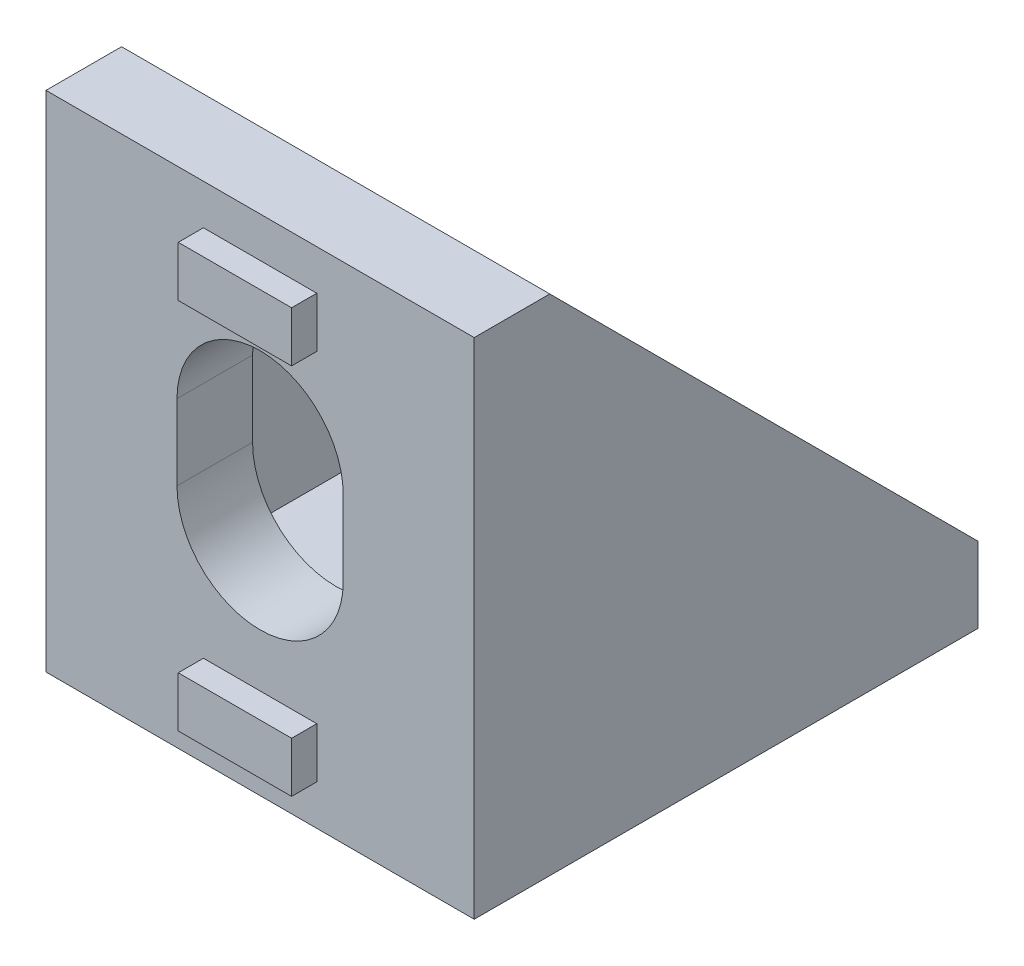
ISO-10303-21;
HEADER;
FILE_DESCRIPTION(('STEP AP214'),'2;1');
FILE_NAME('part.step','',(''),(''),'','','');
FILE_SCHEMA(('AUTOMOTIVE_DESIGN { 1 0 10303 214 1 1 1 1 }'));
ENDSEC;
DATA;
#1=APPLICATION_CONTEXT('core data for automotive mechanical design processes');
#2=APPLICATION_PROTOCOL_DEFINITION('international standard','automotive_design',2000,#1);
#3=PRODUCT_CONTEXT('',#1,'mechanical');
#4=PRODUCT('Part','Part','',(#3));
#5=PRODUCT_RELATED_PRODUCT_CATEGORY('part','',(#4));
#6=PRODUCT_DEFINITION_FORMATION('','',#4);
#7=PRODUCT_DEFINITION_CONTEXT('part definition',#1,'design');
#8=PRODUCT_DEFINITION('design','',#6,#7);
#9=PRODUCT_DEFINITION_SHAPE('','',#8);
#10=(LENGTH_UNIT() NAMED_UNIT(*) SI_UNIT(.MILLI.,.METRE.));
#11=(NAMED_UNIT(*) PLANE_ANGLE_UNIT() SI_UNIT($,.RADIAN.));
#12=(NAMED_UNIT(*) SI_UNIT($,.STERADIAN.) SOLID_ANGLE_UNIT());
#13=UNCERTAINTY_MEASURE_WITH_UNIT(LENGTH_MEASURE(1.E-05),#10,'distance_accuracy_value','');
#14=(GEOMETRIC_REPRESENTATION_CONTEXT(3) GLOBAL_UNCERTAINTY_ASSIGNED_CONTEXT((#13)) GLOBAL_UNIT_ASSIGNED_CONTEXT((#10,
#11,#12)) REPRESENTATION_CONTEXT('',''));
#15=CARTESIAN_POINT('',(0.,0.,0.));
#16=DIRECTION('',(0.,0.,1.));
#17=DIRECTION('',(1.,0.,0.));
#18=AXIS2_PLACEMENT_3D('',#15,#16,#17);
#19=CARTESIAN_POINT('',(3.3,9.,-4.));
#20=DIRECTION('',(1.,0.,0.));
#21=DIRECTION('',(0.,1.,0.));
#22=AXIS2_PLACEMENT_3D('',#19,#20,#21);
#23=PLANE('',#22);
#24=DIRECTION('',(0.,0.,1.));
#25=VECTOR('',#24,1.);
#26=CARTESIAN_POINT('',(3.3,12.,-4.));
#27=LINE('',#26,#25);
#28=CARTESIAN_POINT('',(3.3,12.,-3.));
#29=VERTEX_POINT('',#28);
#30=CARTESIAN_POINT('',(3.3,12.,0.));
#31=VERTEX_POINT('',#30);
#32=EDGE_CURVE('E150',#29,#31,#27,.T.);
#33=ORIENTED_EDGE('',*,*,#32,.F.);
#34=DIRECTION('',(0.,-1.,0.));
#35=VECTOR('',#34,1.);
#36=CARTESIAN_POINT('',(3.3,3.,-3.));
#37=LINE('',#36,#35);
#38=CARTESIAN_POINT('',(3.3,9.,-3.));
#39=VERTEX_POINT('',#38);
#40=EDGE_CURVE('E179',#29,#39,#37,.T.);
#41=ORIENTED_EDGE('',*,*,#40,.T.);
#42=DIRECTION('',(0.,0.,1.));
#43=VECTOR('',#42,1.);
#44=CARTESIAN_POINT('',(3.3,9.,-4.));
#45=LINE('',#44,#43);
#46=CARTESIAN_POINT('',(3.3,9.,0.));
#47=VERTEX_POINT('',#46);
#48=EDGE_CURVE('E11',#39,#47,#45,.T.);
#49=ORIENTED_EDGE('',*,*,#48,.T.);
#50=DIRECTION('',(0.,1.,0.));
#51=VECTOR('',#50,1.);
#52=CARTESIAN_POINT('',(3.3,9.,0.));
#53=LINE('',#52,#51);
#54=EDGE_CURVE('E149',#47,#31,#53,.T.);
#55=ORIENTED_EDGE('',*,*,#54,.T.);
#56=EDGE_LOOP('',(#33,#41,#49,#55));
#57=FACE_BOUND('',#56,.T.);
#58=ADVANCED_FACE('F17',(#57),#23,.F.);
#59=CARTESIAN_POINT('',(0.,9.,-4.));
#60=DIRECTION('',(0.,0.,-1.));
#61=DIRECTION('',(-1.,0.,0.));
#62=AXIS2_PLACEMENT_3D('',#59,#60,#61);
#63=CYLINDRICAL_SURFACE('',#62,3.3);
#64=ORIENTED_EDGE('',*,*,#48,.F.);
#65=CARTESIAN_POINT('',(0.,9.,-3.));
#66=DIRECTION('',(0.,0.,-1.));
#67=DIRECTION('',(1.,0.,0.));
#68=AXIS2_PLACEMENT_3D('',#65,#66,#67);
#69=CIRCLE('',#68,3.3);
#70=CARTESIAN_POINT('',(-3.3,9.,-3.));
#71=VERTEX_POINT('',#70);
#72=EDGE_CURVE('E175',#39,#71,#69,.T.);
#73=ORIENTED_EDGE('',*,*,#72,.T.);
#74=DIRECTION('',(0.,0.,1.));
#75=VECTOR('',#74,1.);
#76=CARTESIAN_POINT('',(-3.3,9.,-4.));
#77=LINE('',#76,#75);
#78=CARTESIAN_POINT('',(-3.3,9.,0.));
#79=VERTEX_POINT('',#78);
#80=EDGE_CURVE('E27',#71,#79,#77,.T.);
#81=ORIENTED_EDGE('',*,*,#80,.T.);
#82=CARTESIAN_POINT('',(0.,9.,0.));
#83=DIRECTION('',(0.,0.,1.));
#84=DIRECTION('',(1.,0.,0.));
#85=AXIS2_PLACEMENT_3D('',#82,#83,#84);
#86=CIRCLE('',#85,3.3);
#87=EDGE_CURVE('E144',#79,#47,#86,.T.);
#88=ORIENTED_EDGE('',*,*,#87,.T.);
#89=EDGE_LOOP('',(#64,#73,#81,#88));
#90=FACE_BOUND('',#89,.T.);
#91=ADVANCED_FACE('F404',(#90),#63,.F.);
#92=CARTESIAN_POINT('',(-3.3,12.,-4.));
#93=DIRECTION('',(-1.,0.,0.));
#94=DIRECTION('',(0.,0.,1.));
#95=AXIS2_PLACEMENT_3D('',#92,#93,#94);
#96=PLANE('',#95);
#97=ORIENTED_EDGE('',*,*,#80,.F.);
#98=DIRECTION('',(0.,1.,0.));
#99=VECTOR('',#98,1.);
#100=CARTESIAN_POINT('',(-3.3,3.,-3.));
#101=LINE('',#100,#99);
#102=CARTESIAN_POINT('',(-3.3,12.,-3.));
#103=VERTEX_POINT('',#102);
#104=EDGE_CURVE('E171',#71,#103,#101,.T.);
#105=ORIENTED_EDGE('',*,*,#104,.T.);
#106=DIRECTION('',(0.,0.,1.));
#107=VECTOR('',#106,1.);
#108=CARTESIAN_POINT('',(-3.3,12.,-4.));
#109=LINE('',#108,#107);
#110=CARTESIAN_POINT('',(-3.3,12.,0.));
#111=VERTEX_POINT('',#110);
#112=EDGE_CURVE('E154',#103,#111,#109,.T.);
#113=ORIENTED_EDGE('',*,*,#112,.T.);
#114=DIRECTION('',(0.,-1.,0.));
#115=VECTOR('',#114,1.);
#116=CARTESIAN_POINT('',(-3.3,12.,0.));
#117=LINE('',#116,#115);
#118=EDGE_CURVE('E148',#111,#79,#117,.T.);
#119=ORIENTED_EDGE('',*,*,#118,.T.);
#120=EDGE_LOOP('',(#97,#105,#113,#119));
#121=FACE_BOUND('',#120,.T.);
#122=ADVANCED_FACE('F19',(#121),#96,.F.);
#123=CARTESIAN_POINT('',(0.,12.,-4.));
#124=DIRECTION('',(0.,0.,-1.));
#125=DIRECTION('',(-1.,0.,0.));
#126=AXIS2_PLACEMENT_3D('',#123,#124,#125);
#127=CYLINDRICAL_SURFACE('',#126,3.3);
#128=ORIENTED_EDGE('',*,*,#112,.F.);
#129=CARTESIAN_POINT('',(0.,12.,-3.));
#130=DIRECTION('',(0.,0.,-1.));
#131=DIRECTION('',(1.,0.,0.));
#132=AXIS2_PLACEMENT_3D('',#129,#130,#131);
#133=CIRCLE('',#132,3.3);
#134=EDGE_CURVE('E185',#103,#29,#133,.T.);
#135=ORIENTED_EDGE('',*,*,#134,.T.);
#136=ORIENTED_EDGE('',*,*,#32,.T.);
#137=CARTESIAN_POINT('',(0.,12.,0.));
#138=DIRECTION('',(0.,0.,1.));
#139=DIRECTION('',(1.,0.,0.));
#140=AXIS2_PLACEMENT_3D('',#137,#138,#139);
#141=CIRCLE('',#140,3.3);
#142=EDGE_CURVE('E427',#31,#111,#141,.T.);
#143=ORIENTED_EDGE('',*,*,#142,.T.);
#144=EDGE_LOOP('',(#128,#135,#136,#143));
#145=FACE_BOUND('',#144,.T.);
#146=ADVANCED_FACE('F1005',(#145),#127,.F.);
#147=CARTESIAN_POINT('',(3.3,4.,-12.));
#148=DIRECTION('',(1.,0.,0.));
#149=DIRECTION('',(0.,1.,0.));
#150=AXIS2_PLACEMENT_3D('',#147,#148,#149);
#151=PLANE('',#150);
#152=DIRECTION('',(0.,-1.,0.));
#153=VECTOR('',#152,1.);
#154=CARTESIAN_POINT('',(3.3,4.,-9.));
#155=LINE('',#154,#153);
#156=CARTESIAN_POINT('',(3.3,3.,-9.));
#157=VERTEX_POINT('',#156);
#158=CARTESIAN_POINT('',(3.3,0.,-9.));
#159=VERTEX_POINT('',#158);
#160=EDGE_CURVE('E265',#157,#159,#155,.T.);
#161=ORIENTED_EDGE('',*,*,#160,.F.);
#162=DIRECTION('',(0.,0.,-1.));
#163=VECTOR('',#162,1.);
#164=CARTESIAN_POINT('',(3.3,3.,-31.));
#165=LINE('',#164,#163);
#166=CARTESIAN_POINT('',(3.3,3.,-12.));
#167=VERTEX_POINT('',#166);
#168=EDGE_CURVE('E294',#157,#167,#165,.T.);
#169=ORIENTED_EDGE('',*,*,#168,.T.);
#170=DIRECTION('',(0.,-1.,0.));
#171=VECTOR('',#170,1.);
#172=CARTESIAN_POINT('',(3.3,4.,-12.));
#173=LINE('',#172,#171);
#174=CARTESIAN_POINT('',(3.3,0.,-12.));
#175=VERTEX_POINT('',#174);
#176=EDGE_CURVE('E390',#167,#175,#173,.T.);
#177=ORIENTED_EDGE('',*,*,#176,.T.);
#178=DIRECTION('',(0.,0.,1.));
#179=VECTOR('',#178,1.);
#180=CARTESIAN_POINT('',(3.3,0.,-12.));
#181=LINE('',#180,#179);
#182=EDGE_CURVE('E250',#175,#159,#181,.T.);
#183=ORIENTED_EDGE('',*,*,#182,.T.);
#184=EDGE_LOOP('',(#161,#169,#177,#183));
#185=FACE_BOUND('',#184,.T.);
#186=ADVANCED_FACE('F995',(#185),#151,.F.);
#187=CARTESIAN_POINT('',(0.,4.,-12.));
#188=DIRECTION('',(0.,1.,0.));
#189=DIRECTION('',(0.,0.,-1.));
#190=AXIS2_PLACEMENT_3D('',#187,#188,#189);
#191=CYLINDRICAL_SURFACE('',#190,3.3);
#192=ORIENTED_EDGE('',*,*,#176,.F.);
#193=CARTESIAN_POINT('',(0.,3.,-12.));
#194=DIRECTION('',(0.,1.,0.));
#195=DIRECTION('',(0.,0.,-1.));
#196=AXIS2_PLACEMENT_3D('',#193,#194,#195);
#197=CIRCLE('',#196,3.3);
#198=CARTESIAN_POINT('',(-3.3,3.,-12.));
#199=VERTEX_POINT('',#198);
#200=EDGE_CURVE('E286',#167,#199,#197,.T.);
#201=ORIENTED_EDGE('',*,*,#200,.T.);
#202=DIRECTION('',(0.,-1.,0.));
#203=VECTOR('',#202,1.);
#204=CARTESIAN_POINT('',(-3.3,4.,-12.));
#205=LINE('',#204,#203);
#206=CARTESIAN_POINT('',(-3.3,0.,-12.));
#207=VERTEX_POINT('',#206);
#208=EDGE_CURVE('E269',#199,#207,#205,.T.);
#209=ORIENTED_EDGE('',*,*,#208,.T.);
#210=CARTESIAN_POINT('',(0.,0.,-12.));
#211=DIRECTION('',(0.,-1.,0.));
#212=DIRECTION('',(1.,0.,0.));
#213=AXIS2_PLACEMENT_3D('',#210,#211,#212);
#214=CIRCLE('',#213,3.3);
#215=EDGE_CURVE('E254',#207,#175,#214,.T.);
#216=ORIENTED_EDGE('',*,*,#215,.T.);
#217=EDGE_LOOP('',(#192,#201,#209,#216));
#218=FACE_BOUND('',#217,.T.);
#219=ADVANCED_FACE('F534',(#218),#191,.F.);
#220=CARTESIAN_POINT('',(-3.3,4.,-9.));
#221=DIRECTION('',(-1.,0.,0.));
#222=DIRECTION('',(0.,0.,1.));
#223=AXIS2_PLACEMENT_3D('',#220,#221,#222);
#224=PLANE('',#223);
#225=ORIENTED_EDGE('',*,*,#208,.F.);
#226=DIRECTION('',(0.,0.,1.));
#227=VECTOR('',#226,1.);
#228=CARTESIAN_POINT('',(-3.3,3.,-31.));
#229=LINE('',#228,#227);
#230=CARTESIAN_POINT('',(-3.3,3.,-9.));
#231=VERTEX_POINT('',#230);
#232=EDGE_CURVE('E142',#199,#231,#229,.T.);
#233=ORIENTED_EDGE('',*,*,#232,.T.);
#234=DIRECTION('',(0.,-1.,0.));
#235=VECTOR('',#234,1.);
#236=CARTESIAN_POINT('',(-3.3,4.,-9.));
#237=LINE('',#236,#235);
#238=CARTESIAN_POINT('',(-3.3,0.,-9.));
#239=VERTEX_POINT('',#238);
#240=EDGE_CURVE('E270',#231,#239,#237,.T.);
#241=ORIENTED_EDGE('',*,*,#240,.T.);
#242=DIRECTION('',(0.,0.,-1.));
#243=VECTOR('',#242,1.);
#244=CARTESIAN_POINT('',(-3.3,0.,-9.));
#245=LINE('',#244,#243);
#246=EDGE_CURVE('E264',#239,#207,#245,.T.);
#247=ORIENTED_EDGE('',*,*,#246,.T.);
#248=EDGE_LOOP('',(#225,#233,#241,#247));
#249=FACE_BOUND('',#248,.T.);
#250=ADVANCED_FACE('F519',(#249),#224,.F.);
#251=CARTESIAN_POINT('',(0.,4.,-9.));
#252=DIRECTION('',(0.,1.,0.));
#253=DIRECTION('',(0.,0.,1.));
#254=AXIS2_PLACEMENT_3D('',#251,#252,#253);
#255=CYLINDRICAL_SURFACE('',#254,3.3);
#256=ORIENTED_EDGE('',*,*,#240,.F.);
#257=CARTESIAN_POINT('',(0.,3.,-9.));
#258=DIRECTION('',(0.,1.,0.));
#259=DIRECTION('',(0.,0.,-1.));
#260=AXIS2_PLACEMENT_3D('',#257,#258,#259);
#261=CIRCLE('',#260,3.3);
#262=EDGE_CURVE('E299',#231,#157,#261,.T.);
#263=ORIENTED_EDGE('',*,*,#262,.T.);
#264=ORIENTED_EDGE('',*,*,#160,.T.);
#265=CARTESIAN_POINT('',(0.,0.,-9.));
#266=DIRECTION('',(0.,-1.,0.));
#267=DIRECTION('',(1.,0.,0.));
#268=AXIS2_PLACEMENT_3D('',#265,#266,#267);
#269=CIRCLE('',#268,3.3);
#270=EDGE_CURVE('E246',#159,#239,#269,.T.);
#271=ORIENTED_EDGE('',*,*,#270,.T.);
#272=EDGE_LOOP('',(#256,#263,#264,#271));
#273=FACE_BOUND('',#272,.T.);
#274=ADVANCED_FACE('F796',(#273),#255,.F.);
#275=CARTESIAN_POINT('',(2.25,-1.,-16.4));
#276=DIRECTION('',(0.,0.,1.));
#277=DIRECTION('',(1.,0.,0.));
#278=AXIS2_PLACEMENT_3D('',#275,#276,#277);
#279=PLANE('',#278);
#280=DIRECTION('',(0.,1.,0.));
#281=VECTOR('',#280,1.);
#282=CARTESIAN_POINT('',(-2.25,-1.,-16.4));
#283=LINE('',#282,#281);
#284=CARTESIAN_POINT('',(-2.25,-1.,-16.4));
#285=VERTEX_POINT('',#284);
#286=CARTESIAN_POINT('',(-2.25,0.,-16.4));
#287=VERTEX_POINT('',#286);
#288=EDGE_CURVE('E106',#285,#287,#283,.T.);
#289=ORIENTED_EDGE('',*,*,#288,.F.);
#290=DIRECTION('',(-1.,0.,0.));
#291=VECTOR('',#290,1.);
#292=CARTESIAN_POINT('',(2.25,-1.,-16.4));
#293=LINE('',#292,#291);
#294=CARTESIAN_POINT('',(2.25,-1.,-16.4));
#295=VERTEX_POINT('',#294);
#296=EDGE_CURVE('E39',#295,#285,#293,.T.);
#297=ORIENTED_EDGE('',*,*,#296,.F.);
#298=DIRECTION('',(0.,1.,0.));
#299=VECTOR('',#298,1.);
#300=CARTESIAN_POINT('',(2.25,-1.,-16.4));
#301=LINE('',#300,#299);
#302=CARTESIAN_POINT('',(2.25,0.,-16.4));
#303=VERTEX_POINT('',#302);
#304=EDGE_CURVE('E120',#295,#303,#301,.T.);
#305=ORIENTED_EDGE('',*,*,#304,.T.);
#306=DIRECTION('',(-1.,0.,0.));
#307=VECTOR('',#306,1.);
#308=CARTESIAN_POINT('',(2.25,0.,-16.4));
#309=LINE('',#308,#307);
#310=EDGE_CURVE('E180',#303,#287,#309,.T.);
#311=ORIENTED_EDGE('',*,*,#310,.T.);
#312=EDGE_LOOP('',(#289,#297,#305,#311));
#313=FACE_BOUND('',#312,.T.);
#314=ADVANCED_FACE('F744',(#313),#279,.T.);
#315=CARTESIAN_POINT('',(2.25,-1.,-18.4));
#316=DIRECTION('',(0.,-1.,0.));
#317=DIRECTION('',(0.,0.,-1.));
#318=AXIS2_PLACEMENT_3D('',#315,#316,#317);
#319=PLANE('',#318);
#320=DIRECTION('',(0.,0.,1.));
#321=VECTOR('',#320,1.);
#322=CARTESIAN_POINT('',(-2.25,-1.,-18.4));
#323=LINE('',#322,#321);
#324=CARTESIAN_POINT('',(-2.25,-1.,-18.4));
#325=VERTEX_POINT('',#324);
#326=EDGE_CURVE('E97',#325,#285,#323,.T.);
#327=ORIENTED_EDGE('',*,*,#326,.F.);
#328=DIRECTION('',(-1.,0.,0.));
#329=VECTOR('',#328,1.);
#330=CARTESIAN_POINT('',(2.25,-1.,-18.4));
#331=LINE('',#330,#329);
#332=CARTESIAN_POINT('',(2.25,-1.,-18.4));
#333=VERTEX_POINT('',#332);
#334=EDGE_CURVE('E101',#333,#325,#331,.T.);
#335=ORIENTED_EDGE('',*,*,#334,.F.);
#336=DIRECTION('',(0.,0.,1.));
#337=VECTOR('',#336,1.);
#338=CARTESIAN_POINT('',(2.25,-1.,-18.4));
#339=LINE('',#338,#337);
#340=EDGE_CURVE('E107',#333,#295,#339,.T.);
#341=ORIENTED_EDGE('',*,*,#340,.T.);
#342=ORIENTED_EDGE('',*,*,#296,.T.);
#343=EDGE_LOOP('',(#327,#335,#341,#342));
#344=FACE_BOUND('',#343,.T.);
#345=ADVANCED_FACE('F99',(#344),#319,.T.);
#346=CARTESIAN_POINT('',(-2.25,0.,0.));
#347=DIRECTION('',(-1.,0.,0.));
#348=DIRECTION('',(0.,0.,1.));
#349=AXIS2_PLACEMENT_3D('',#346,#347,#348);
#350=PLANE('',#349);
#351=DIRECTION('',(0.,-1.,0.));
#352=VECTOR('',#351,1.);
#353=CARTESIAN_POINT('',(-2.25,0.5,-18.4));
#354=LINE('',#353,#352);
#355=CARTESIAN_POINT('',(-2.25,0.,-18.4));
#356=VERTEX_POINT('',#355);
#357=EDGE_CURVE('E111',#356,#325,#354,.T.);
#358=ORIENTED_EDGE('',*,*,#357,.T.);
#359=ORIENTED_EDGE('',*,*,#326,.T.);
#360=ORIENTED_EDGE('',*,*,#288,.T.);
#361=DIRECTION('',(0.,0.,1.));
#362=VECTOR('',#361,1.);
#363=CARTESIAN_POINT('',(-2.25,0.,-20.));
#364=LINE('',#363,#362);
#365=EDGE_CURVE('E115',#356,#287,#364,.T.);
#366=ORIENTED_EDGE('',*,*,#365,.F.);
#367=EDGE_LOOP('',(#358,#359,#360,#366));
#368=FACE_BOUND('',#367,.T.);
#369=ADVANCED_FACE('F112',(#368),#350,.T.);
#370=CARTESIAN_POINT('',(2.25,0.,0.));
#371=DIRECTION('',(-1.,0.,0.));
#372=DIRECTION('',(0.,0.,1.));
#373=AXIS2_PLACEMENT_3D('',#370,#371,#372);
#374=PLANE('',#373);
#375=DIRECTION('',(0.,0.,1.));
#376=VECTOR('',#375,1.);
#377=CARTESIAN_POINT('',(2.25,0.,-20.));
#378=LINE('',#377,#376);
#379=CARTESIAN_POINT('',(2.25,0.,-18.4));
#380=VERTEX_POINT('',#379);
#381=EDGE_CURVE('E184',#380,#303,#378,.T.);
#382=ORIENTED_EDGE('',*,*,#381,.T.);
#383=ORIENTED_EDGE('',*,*,#304,.F.);
#384=ORIENTED_EDGE('',*,*,#340,.F.);
#385=DIRECTION('',(0.,-1.,0.));
#386=VECTOR('',#385,1.);
#387=CARTESIAN_POINT('',(2.25,0.5,-18.4));
#388=LINE('',#387,#386);
#389=EDGE_CURVE('E124',#380,#333,#388,.T.);
#390=ORIENTED_EDGE('',*,*,#389,.F.);
#391=EDGE_LOOP('',(#382,#383,#384,#390));
#392=FACE_BOUND('',#391,.T.);
#393=ADVANCED_FACE('F749',(#392),#374,.F.);
#394=CARTESIAN_POINT('',(2.25,0.5,-18.4));
#395=DIRECTION('',(0.,0.,-1.));
#396=DIRECTION('',(0.,-1.,0.));
#397=AXIS2_PLACEMENT_3D('',#394,#395,#396);
#398=PLANE('',#397);
#399=ORIENTED_EDGE('',*,*,#389,.T.);
#400=ORIENTED_EDGE('',*,*,#334,.T.);
#401=ORIENTED_EDGE('',*,*,#357,.F.);
#402=DIRECTION('',(-1.,0.,0.));
#403=VECTOR('',#402,1.);
#404=CARTESIAN_POINT('',(8.5,0.,-18.4));
#405=LINE('',#404,#403);
#406=EDGE_CURVE('E207',#380,#356,#405,.T.);
#407=ORIENTED_EDGE('',*,*,#406,.F.);
#408=EDGE_LOOP('',(#399,#400,#401,#407));
#409=FACE_BOUND('',#408,.T.);
#410=ADVANCED_FACE('F122',(#409),#398,.T.);
#411=CARTESIAN_POINT('',(2.25,0.,-3.6));
#412=DIRECTION('',(0.,0.,-1.));
#413=DIRECTION('',(-1.,0.,0.));
#414=AXIS2_PLACEMENT_3D('',#411,#412,#413);
#415=PLANE('',#414);
#416=DIRECTION('',(0.,-1.,0.));
#417=VECTOR('',#416,1.);
#418=CARTESIAN_POINT('',(-2.25,0.,-3.6));
#419=LINE('',#418,#417);
#420=CARTESIAN_POINT('',(-2.25,0.,-3.6));
#421=VERTEX_POINT('',#420);
#422=CARTESIAN_POINT('',(-2.25,-1.,-3.6));
#423=VERTEX_POINT('',#422);
#424=EDGE_CURVE('E245',#421,#423,#419,.T.);
#425=ORIENTED_EDGE('',*,*,#424,.F.);
#426=DIRECTION('',(-1.,0.,0.));
#427=VECTOR('',#426,1.);
#428=CARTESIAN_POINT('',(2.25,0.,-3.6));
#429=LINE('',#428,#427);
#430=CARTESIAN_POINT('',(2.25,0.,-3.6));
#431=VERTEX_POINT('',#430);
#432=EDGE_CURVE('E218',#431,#421,#429,.T.);
#433=ORIENTED_EDGE('',*,*,#432,.F.);
#434=DIRECTION('',(0.,-1.,0.));
#435=VECTOR('',#434,1.);
#436=CARTESIAN_POINT('',(2.25,0.,-3.6));
#437=LINE('',#436,#435);
#438=CARTESIAN_POINT('',(2.25,-1.,-3.6));
#439=VERTEX_POINT('',#438);
#440=EDGE_CURVE('E287',#431,#439,#437,.T.);
#441=ORIENTED_EDGE('',*,*,#440,.T.);
#442=DIRECTION('',(-1.,0.,0.));
#443=VECTOR('',#442,1.);
#444=CARTESIAN_POINT('',(2.25,-1.,-3.6));
#445=LINE('',#444,#443);
#446=EDGE_CURVE('E259',#439,#423,#445,.T.);
#447=ORIENTED_EDGE('',*,*,#446,.T.);
#448=EDGE_LOOP('',(#425,#433,#441,#447));
#449=FACE_BOUND('',#448,.T.);
#450=ADVANCED_FACE('F686',(#449),#415,.T.);
#451=CARTESIAN_POINT('',(2.25,-1.,-1.6));
#452=DIRECTION('',(0.,0.,1.));
#453=DIRECTION('',(0.,-1.,0.));
#454=AXIS2_PLACEMENT_3D('',#451,#452,#453);
#455=PLANE('',#454);
#456=DIRECTION('',(0.,1.,0.));
#457=VECTOR('',#456,1.);
#458=CARTESIAN_POINT('',(-2.25,-1.,-1.6));
#459=LINE('',#458,#457);
#460=CARTESIAN_POINT('',(-2.25,-1.,-1.6));
#461=VERTEX_POINT('',#460);
#462=CARTESIAN_POINT('',(-2.25,0.,-1.6));
#463=VERTEX_POINT('',#462);
#464=EDGE_CURVE('E132',#461,#463,#459,.T.);
#465=ORIENTED_EDGE('',*,*,#464,.F.);
#466=DIRECTION('',(-1.,0.,0.));
#467=VECTOR('',#466,1.);
#468=CARTESIAN_POINT('',(2.25,-1.,-1.6));
#469=LINE('',#468,#467);
#470=CARTESIAN_POINT('',(2.25,-1.,-1.6));
#471=VERTEX_POINT('',#470);
#472=EDGE_CURVE('E370',#471,#461,#469,.T.);
#473=ORIENTED_EDGE('',*,*,#472,.F.);
#474=DIRECTION('',(0.,1.,0.));
#475=VECTOR('',#474,1.);
#476=CARTESIAN_POINT('',(2.25,-1.,-1.6));
#477=LINE('',#476,#475);
#478=CARTESIAN_POINT('',(2.25,0.,-1.6));
#479=VERTEX_POINT('',#478);
#480=EDGE_CURVE('E290',#471,#479,#477,.T.);
#481=ORIENTED_EDGE('',*,*,#480,.T.);
#482=DIRECTION('',(1.,0.,0.));
#483=VECTOR('',#482,1.);
#484=CARTESIAN_POINT('',(8.5,0.,-1.6));
#485=LINE('',#484,#483);
#486=EDGE_CURVE('E237',#463,#479,#485,.T.);
#487=ORIENTED_EDGE('',*,*,#486,.F.);
#488=EDGE_LOOP('',(#465,#473,#481,#487));
#489=FACE_BOUND('',#488,.T.);
#490=ADVANCED_FACE('F669',(#489),#455,.T.);
#491=CARTESIAN_POINT('',(-2.25,0.,0.));
#492=DIRECTION('',(-1.,0.,0.));
#493=DIRECTION('',(0.,0.,1.));
#494=AXIS2_PLACEMENT_3D('',#491,#492,#493);
#495=PLANE('',#494);
#496=ORIENTED_EDGE('',*,*,#424,.T.);
#497=DIRECTION('',(0.,0.,1.));
#498=VECTOR('',#497,1.);
#499=CARTESIAN_POINT('',(-2.25,-1.,-3.6));
#500=LINE('',#499,#498);
#501=EDGE_CURVE('E255',#423,#461,#500,.T.);
#502=ORIENTED_EDGE('',*,*,#501,.T.);
#503=ORIENTED_EDGE('',*,*,#464,.T.);
#504=DIRECTION('',(0.,0.,1.));
#505=VECTOR('',#504,1.);
#506=CARTESIAN_POINT('',(-2.25,0.,-20.));
#507=LINE('',#506,#505);
#508=EDGE_CURVE('E229',#421,#463,#507,.T.);
#509=ORIENTED_EDGE('',*,*,#508,.F.);
#510=EDGE_LOOP('',(#496,#502,#503,#509));
#511=FACE_BOUND('',#510,.T.);
#512=ADVANCED_FACE('F680',(#511),#495,.T.);
#513=CARTESIAN_POINT('',(2.25,0.,0.));
#514=DIRECTION('',(-1.,0.,0.));
#515=DIRECTION('',(0.,0.,1.));
#516=AXIS2_PLACEMENT_3D('',#513,#514,#515);
#517=PLANE('',#516);
#518=DIRECTION('',(0.,0.,1.));
#519=VECTOR('',#518,1.);
#520=CARTESIAN_POINT('',(2.25,0.,-20.));
#521=LINE('',#520,#519);
#522=EDGE_CURVE('E241',#431,#479,#521,.T.);
#523=ORIENTED_EDGE('',*,*,#522,.T.);
#524=ORIENTED_EDGE('',*,*,#480,.F.);
#525=DIRECTION('',(0.,0.,1.));
#526=VECTOR('',#525,1.);
#527=CARTESIAN_POINT('',(2.25,-1.,-3.6));
#528=LINE('',#527,#526);
#529=EDGE_CURVE('E298',#439,#471,#528,.T.);
#530=ORIENTED_EDGE('',*,*,#529,.F.);
#531=ORIENTED_EDGE('',*,*,#440,.F.);
#532=EDGE_LOOP('',(#523,#524,#530,#531));
#533=FACE_BOUND('',#532,.T.);
#534=ADVANCED_FACE('F674',(#533),#517,.F.);
#535=CARTESIAN_POINT('',(2.25,-1.,-3.6));
#536=DIRECTION('',(0.,-1.,0.));
#537=DIRECTION('',(0.,0.,-1.));
#538=AXIS2_PLACEMENT_3D('',#535,#536,#537);
#539=PLANE('',#538);
#540=ORIENTED_EDGE('',*,*,#501,.F.);
#541=ORIENTED_EDGE('',*,*,#446,.F.);
#542=ORIENTED_EDGE('',*,*,#529,.T.);
#543=ORIENTED_EDGE('',*,*,#472,.T.);
#544=EDGE_LOOP('',(#540,#541,#542,#543));
#545=FACE_BOUND('',#544,.T.);
#546=ADVANCED_FACE('F683',(#545),#539,.T.);
#547=CARTESIAN_POINT('',(2.25,3.6,1.));
#548=DIRECTION('',(0.,1.,0.));
#549=DIRECTION('',(1.,0.,0.));
#550=AXIS2_PLACEMENT_3D('',#547,#548,#549);
#551=PLANE('',#550);
#552=DIRECTION('',(0.,0.,-1.));
#553=VECTOR('',#552,1.);
#554=CARTESIAN_POINT('',(-2.25,3.6,1.));
#555=LINE('',#554,#553);
#556=CARTESIAN_POINT('',(-2.25,3.6,1.));
#557=VERTEX_POINT('',#556);
#558=CARTESIAN_POINT('',(-2.25,3.6,0.));
#559=VERTEX_POINT('',#558);
#560=EDGE_CURVE('E202',#557,#559,#555,.T.);
#561=ORIENTED_EDGE('',*,*,#560,.F.);
#562=DIRECTION('',(-1.,0.,0.));
#563=VECTOR('',#562,1.);
#564=CARTESIAN_POINT('',(2.25,3.6,1.));
#565=LINE('',#564,#563);
#566=CARTESIAN_POINT('',(2.25,3.6,1.));
#567=VERTEX_POINT('',#566);
#568=EDGE_CURVE('E260',#567,#557,#565,.T.);
#569=ORIENTED_EDGE('',*,*,#568,.F.);
#570=DIRECTION('',(0.,0.,-1.));
#571=VECTOR('',#570,1.);
#572=CARTESIAN_POINT('',(2.25,3.6,1.));
#573=LINE('',#572,#571);
#574=CARTESIAN_POINT('',(2.25,3.6,0.));
#575=VERTEX_POINT('',#574);
#576=EDGE_CURVE('E278',#567,#575,#573,.T.);
#577=ORIENTED_EDGE('',*,*,#576,.T.);
#578=DIRECTION('',(-1.,0.,0.));
#579=VECTOR('',#578,1.);
#580=CARTESIAN_POINT('',(2.25,3.6,0.));
#581=LINE('',#580,#579);
#582=EDGE_CURVE('E464',#575,#559,#581,.T.);
#583=ORIENTED_EDGE('',*,*,#582,.T.);
#584=EDGE_LOOP('',(#561,#569,#577,#583));
#585=FACE_BOUND('',#584,.T.);
#586=ADVANCED_FACE('F720',(#585),#551,.T.);
#587=CARTESIAN_POINT('',(2.25,1.6,1.));
#588=DIRECTION('',(0.,0.,1.));
#589=DIRECTION('',(1.,0.,0.));
#590=AXIS2_PLACEMENT_3D('',#587,#588,#589);
#591=PLANE('',#590);
#592=DIRECTION('',(0.,1.,0.));
#593=VECTOR('',#592,1.);
#594=CARTESIAN_POINT('',(-2.25,1.6,1.));
#595=LINE('',#594,#593);
#596=CARTESIAN_POINT('',(-2.25,1.6,1.));
#597=VERTEX_POINT('',#596);
#598=EDGE_CURVE('E198',#597,#557,#595,.T.);
#599=ORIENTED_EDGE('',*,*,#598,.F.);
#600=DIRECTION('',(-1.,0.,0.));
#601=VECTOR('',#600,1.);
#602=CARTESIAN_POINT('',(2.25,1.6,1.));
#603=LINE('',#602,#601);
#604=CARTESIAN_POINT('',(2.25,1.6,1.));
#605=VERTEX_POINT('',#604);
#606=EDGE_CURVE('E363',#605,#597,#603,.T.);
#607=ORIENTED_EDGE('',*,*,#606,.F.);
#608=DIRECTION('',(0.,1.,0.));
#609=VECTOR('',#608,1.);
#610=CARTESIAN_POINT('',(2.25,1.6,1.));
#611=LINE('',#610,#609);
#612=EDGE_CURVE('E203',#605,#567,#611,.T.);
#613=ORIENTED_EDGE('',*,*,#612,.T.);
#614=ORIENTED_EDGE('',*,*,#568,.T.);
#615=EDGE_LOOP('',(#599,#607,#613,#614));
#616=FACE_BOUND('',#615,.T.);
#617=ADVANCED_FACE('F734',(#616),#591,.T.);
#618=CARTESIAN_POINT('',(-2.25,0.,0.));
#619=DIRECTION('',(-1.,0.,0.));
#620=DIRECTION('',(0.,0.,1.));
#621=AXIS2_PLACEMENT_3D('',#618,#619,#620);
#622=PLANE('',#621);
#623=DIRECTION('',(0.,0.,1.));
#624=VECTOR('',#623,1.);
#625=CARTESIAN_POINT('',(-2.25,1.6,-0.5));
#626=LINE('',#625,#624);
#627=CARTESIAN_POINT('',(-2.25,1.6,0.));
#628=VERTEX_POINT('',#627);
#629=EDGE_CURVE('E282',#628,#597,#626,.T.);
#630=ORIENTED_EDGE('',*,*,#629,.T.);
#631=ORIENTED_EDGE('',*,*,#598,.T.);
#632=ORIENTED_EDGE('',*,*,#560,.T.);
#633=DIRECTION('',(0.,1.,0.));
#634=VECTOR('',#633,1.);
#635=CARTESIAN_POINT('',(-2.25,0.,0.));
#636=LINE('',#635,#634);
#637=EDGE_CURVE('E460',#628,#559,#636,.T.);
#638=ORIENTED_EDGE('',*,*,#637,.F.);
#639=EDGE_LOOP('',(#630,#631,#632,#638));
#640=FACE_BOUND('',#639,.T.);
#641=ADVANCED_FACE('F731',(#640),#622,.T.);
#642=CARTESIAN_POINT('',(2.25,0.,0.));
#643=DIRECTION('',(-1.,0.,0.));
#644=DIRECTION('',(0.,0.,1.));
#645=AXIS2_PLACEMENT_3D('',#642,#643,#644);
#646=PLANE('',#645);
#647=DIRECTION('',(0.,1.,0.));
#648=VECTOR('',#647,1.);
#649=CARTESIAN_POINT('',(2.25,0.,0.));
#650=LINE('',#649,#648);
#651=CARTESIAN_POINT('',(2.25,1.6,0.));
#652=VERTEX_POINT('',#651);
#653=EDGE_CURVE('E476',#652,#575,#650,.T.);
#654=ORIENTED_EDGE('',*,*,#653,.T.);
#655=ORIENTED_EDGE('',*,*,#576,.F.);
#656=ORIENTED_EDGE('',*,*,#612,.F.);
#657=DIRECTION('',(0.,0.,1.));
#658=VECTOR('',#657,1.);
#659=CARTESIAN_POINT('',(2.25,1.6,-0.5));
#660=LINE('',#659,#658);
#661=EDGE_CURVE('E362',#652,#605,#660,.T.);
#662=ORIENTED_EDGE('',*,*,#661,.F.);
#663=EDGE_LOOP('',(#654,#655,#656,#662));
#664=FACE_BOUND('',#663,.T.);
#665=ADVANCED_FACE('F724',(#664),#646,.F.);
#666=CARTESIAN_POINT('',(2.25,1.6,-0.5));
#667=DIRECTION('',(0.,-1.,0.));
#668=DIRECTION('',(0.,0.,-1.));
#669=AXIS2_PLACEMENT_3D('',#666,#667,#668);
#670=PLANE('',#669);
#671=ORIENTED_EDGE('',*,*,#661,.T.);
#672=ORIENTED_EDGE('',*,*,#606,.T.);
#673=ORIENTED_EDGE('',*,*,#629,.F.);
#674=DIRECTION('',(-1.,0.,0.));
#675=VECTOR('',#674,1.);
#676=CARTESIAN_POINT('',(8.5,1.6,0.));
#677=LINE('',#676,#675);
#678=EDGE_CURVE('E465',#652,#628,#677,.T.);
#679=ORIENTED_EDGE('',*,*,#678,.F.);
#680=EDGE_LOOP('',(#671,#672,#673,#679));
#681=FACE_BOUND('',#680,.T.);
#682=ADVANCED_FACE('F736',(#681),#670,.T.);
#683=CARTESIAN_POINT('',(2.25,18.4,1.));
#684=DIRECTION('',(0.,1.,0.));
#685=DIRECTION('',(1.,0.,0.));
#686=AXIS2_PLACEMENT_3D('',#683,#684,#685);
#687=PLANE('',#686);
#688=DIRECTION('',(0.,0.,-1.));
#689=VECTOR('',#688,1.);
#690=CARTESIAN_POINT('',(-2.25,18.4,1.));
#691=LINE('',#690,#689);
#692=CARTESIAN_POINT('',(-2.25,18.4,1.));
#693=VERTEX_POINT('',#692);
#694=CARTESIAN_POINT('',(-2.25,18.4,0.));
#695=VERTEX_POINT('',#694);
#696=EDGE_CURVE('E358',#693,#695,#691,.T.);
#697=ORIENTED_EDGE('',*,*,#696,.F.);
#698=DIRECTION('',(-1.,0.,0.));
#699=VECTOR('',#698,1.);
#700=CARTESIAN_POINT('',(2.25,18.4,1.));
#701=LINE('',#700,#699);
#702=CARTESIAN_POINT('',(2.25,18.4,1.));
#703=VERTEX_POINT('',#702);
#704=EDGE_CURVE('E341',#703,#693,#701,.T.);
#705=ORIENTED_EDGE('',*,*,#704,.F.);
#706=DIRECTION('',(0.,0.,-1.));
#707=VECTOR('',#706,1.);
#708=CARTESIAN_POINT('',(2.25,18.4,1.));
#709=LINE('',#708,#707);
#710=CARTESIAN_POINT('',(2.25,18.4,0.));
#711=VERTEX_POINT('',#710);
#712=EDGE_CURVE('E347',#703,#711,#709,.T.);
#713=ORIENTED_EDGE('',*,*,#712,.T.);
#714=DIRECTION('',(1.,0.,0.));
#715=VECTOR('',#714,1.);
#716=CARTESIAN_POINT('',(8.5,18.4,0.));
#717=LINE('',#716,#715);
#718=EDGE_CURVE('E440',#695,#711,#717,.T.);
#719=ORIENTED_EDGE('',*,*,#718,.F.);
#720=EDGE_LOOP('',(#697,#705,#713,#719));
#721=FACE_BOUND('',#720,.T.);
#722=ADVANCED_FACE('F588',(#721),#687,.T.);
#723=CARTESIAN_POINT('',(2.25,16.4,0.));
#724=DIRECTION('',(0.,-1.,0.));
#725=DIRECTION('',(0.,0.,-1.));
#726=AXIS2_PLACEMENT_3D('',#723,#724,#725);
#727=PLANE('',#726);
#728=DIRECTION('',(0.,0.,1.));
#729=VECTOR('',#728,1.);
#730=CARTESIAN_POINT('',(-2.25,16.4,0.));
#731=LINE('',#730,#729);
#732=CARTESIAN_POINT('',(-2.25,16.4,0.));
#733=VERTEX_POINT('',#732);
#734=CARTESIAN_POINT('',(-2.25,16.4,1.));
#735=VERTEX_POINT('',#734);
#736=EDGE_CURVE('E354',#733,#735,#731,.T.);
#737=ORIENTED_EDGE('',*,*,#736,.F.);
#738=DIRECTION('',(-1.,0.,0.));
#739=VECTOR('',#738,1.);
#740=CARTESIAN_POINT('',(2.25,16.4,0.));
#741=LINE('',#740,#739);
#742=CARTESIAN_POINT('',(2.25,16.4,0.));
#743=VERTEX_POINT('',#742);
#744=EDGE_CURVE('E486',#743,#733,#741,.T.);
#745=ORIENTED_EDGE('',*,*,#744,.F.);
#746=DIRECTION('',(0.,0.,1.));
#747=VECTOR('',#746,1.);
#748=CARTESIAN_POINT('',(2.25,16.4,0.));
#749=LINE('',#748,#747);
#750=CARTESIAN_POINT('',(2.25,16.4,1.));
#751=VERTEX_POINT('',#750);
#752=EDGE_CURVE('E351',#743,#751,#749,.T.);
#753=ORIENTED_EDGE('',*,*,#752,.T.);
#754=DIRECTION('',(-1.,0.,0.));
#755=VECTOR('',#754,1.);
#756=CARTESIAN_POINT('',(2.25,16.4,1.));
#757=LINE('',#756,#755);
#758=EDGE_CURVE('E330',#751,#735,#757,.T.);
#759=ORIENTED_EDGE('',*,*,#758,.T.);
#760=EDGE_LOOP('',(#737,#745,#753,#759));
#761=FACE_BOUND('',#760,.T.);
#762=ADVANCED_FACE('F581',(#761),#727,.T.);
#763=CARTESIAN_POINT('',(-2.25,0.,0.));
#764=DIRECTION('',(-1.,0.,0.));
#765=DIRECTION('',(0.,0.,1.));
#766=AXIS2_PLACEMENT_3D('',#763,#764,#765);
#767=PLANE('',#766);
#768=ORIENTED_EDGE('',*,*,#736,.T.);
#769=DIRECTION('',(0.,1.,0.));
#770=VECTOR('',#769,1.);
#771=CARTESIAN_POINT('',(-2.25,16.4,1.));
#772=LINE('',#771,#770);
#773=EDGE_CURVE('E329',#735,#693,#772,.T.);
#774=ORIENTED_EDGE('',*,*,#773,.T.);
#775=ORIENTED_EDGE('',*,*,#696,.T.);
#776=DIRECTION('',(0.,1.,0.));
#777=VECTOR('',#776,1.);
#778=CARTESIAN_POINT('',(-2.25,0.,0.));
#779=LINE('',#778,#777);
#780=EDGE_CURVE('E444',#733,#695,#779,.T.);
#781=ORIENTED_EDGE('',*,*,#780,.F.);
#782=EDGE_LOOP('',(#768,#774,#775,#781));
#783=FACE_BOUND('',#782,.T.);
#784=ADVANCED_FACE('F577',(#783),#767,.T.);
#785=CARTESIAN_POINT('',(2.25,0.,0.));
#786=DIRECTION('',(-1.,0.,0.));
#787=DIRECTION('',(0.,0.,1.));
#788=AXIS2_PLACEMENT_3D('',#785,#786,#787);
#789=PLANE('',#788);
#790=DIRECTION('',(0.,1.,0.));
#791=VECTOR('',#790,1.);
#792=CARTESIAN_POINT('',(2.25,0.,0.));
#793=LINE('',#792,#791);
#794=EDGE_CURVE('E136',#743,#711,#793,.T.);
#795=ORIENTED_EDGE('',*,*,#794,.T.);
#796=ORIENTED_EDGE('',*,*,#712,.F.);
#797=DIRECTION('',(0.,1.,0.));
#798=VECTOR('',#797,1.);
#799=CARTESIAN_POINT('',(2.25,16.4,1.));
#800=LINE('',#799,#798);
#801=EDGE_CURVE('E334',#751,#703,#800,.T.);
#802=ORIENTED_EDGE('',*,*,#801,.F.);
#803=ORIENTED_EDGE('',*,*,#752,.F.);
#804=EDGE_LOOP('',(#795,#796,#802,#803));
#805=FACE_BOUND('',#804,.T.);
#806=ADVANCED_FACE('F770',(#805),#789,.F.);
#807=CARTESIAN_POINT('',(2.25,16.4,1.));
#808=DIRECTION('',(0.,0.,1.));
#809=DIRECTION('',(1.,0.,0.));
#810=AXIS2_PLACEMENT_3D('',#807,#808,#809);
#811=PLANE('',#810);
#812=ORIENTED_EDGE('',*,*,#773,.F.);
#813=ORIENTED_EDGE('',*,*,#758,.F.);
#814=ORIENTED_EDGE('',*,*,#801,.T.);
#815=ORIENTED_EDGE('',*,*,#704,.T.);
#816=EDGE_LOOP('',(#812,#813,#814,#815));
#817=FACE_BOUND('',#816,.T.);
#818=ADVANCED_FACE('F585',(#817),#811,.T.);
#819=CARTESIAN_POINT('',(-6.5,0.,0.));
#820=DIRECTION('',(-1.,0.,0.));
#821=DIRECTION('',(0.,0.,1.));
#822=AXIS2_PLACEMENT_3D('',#819,#820,#821);
#823=PLANE('',#822);
#824=DIRECTION('',(0.,-0.707106781186548,-0.707106781186548));
#825=VECTOR('',#824,1.);
#826=CARTESIAN_POINT('',(-6.5,20.,-3.));
#827=LINE('',#826,#825);
#828=CARTESIAN_POINT('',(-6.5,20.,-3.));
#829=VERTEX_POINT('',#828);
#830=CARTESIAN_POINT('',(-6.5,3.,-20.));
#831=VERTEX_POINT('',#830);
#832=EDGE_CURVE('E213',#829,#831,#827,.T.);
#833=ORIENTED_EDGE('',*,*,#832,.F.);
#834=DIRECTION('',(0.,1.,0.));
#835=VECTOR('',#834,1.);
#836=CARTESIAN_POINT('',(-6.5,3.,-3.));
#837=LINE('',#836,#835);
#838=CARTESIAN_POINT('',(-6.5,3.,-3.));
#839=VERTEX_POINT('',#838);
#840=EDGE_CURVE('E167',#839,#829,#837,.T.);
#841=ORIENTED_EDGE('',*,*,#840,.F.);
#842=DIRECTION('',(0.,0.,1.));
#843=VECTOR('',#842,1.);
#844=CARTESIAN_POINT('',(-6.5,3.,-31.));
#845=LINE('',#844,#843);
#846=EDGE_CURVE('E143',#831,#839,#845,.T.);
#847=ORIENTED_EDGE('',*,*,#846,.F.);
#848=EDGE_LOOP('',(#833,#841,#847));
#849=FACE_BOUND('',#848,.T.);
#850=ADVANCED_FACE('F766',(#849),#823,.F.);
#851=CARTESIAN_POINT('',(6.5,0.,0.));
#852=DIRECTION('',(-1.,0.,0.));
#853=DIRECTION('',(0.,0.,1.));
#854=AXIS2_PLACEMENT_3D('',#851,#852,#853);
#855=PLANE('',#854);
#856=DIRECTION('',(0.,1.,0.));
#857=VECTOR('',#856,1.);
#858=CARTESIAN_POINT('',(6.5,3.,-3.));
#859=LINE('',#858,#857);
#860=CARTESIAN_POINT('',(6.5,3.,-3.));
#861=VERTEX_POINT('',#860);
#862=CARTESIAN_POINT('',(6.5,20.,-3.));
#863=VERTEX_POINT('',#862);
#864=EDGE_CURVE('E158',#861,#863,#859,.T.);
#865=ORIENTED_EDGE('',*,*,#864,.T.);
#866=DIRECTION('',(0.,-0.707106781186548,-0.707106781186548));
#867=VECTOR('',#866,1.);
#868=CARTESIAN_POINT('',(6.5,20.,-3.));
#869=LINE('',#868,#867);
#870=CARTESIAN_POINT('',(6.5,3.,-20.));
#871=VERTEX_POINT('',#870);
#872=EDGE_CURVE('E312',#863,#871,#869,.T.);
#873=ORIENTED_EDGE('',*,*,#872,.T.);
#874=DIRECTION('',(0.,0.,1.));
#875=VECTOR('',#874,1.);
#876=CARTESIAN_POINT('',(6.5,3.,-31.));
#877=LINE('',#876,#875);
#878=EDGE_CURVE('E138',#871,#861,#877,.T.);
#879=ORIENTED_EDGE('',*,*,#878,.T.);
#880=EDGE_LOOP('',(#865,#873,#879));
#881=FACE_BOUND('',#880,.T.);
#882=ADVANCED_FACE('F870',(#881),#855,.T.);
#883=CARTESIAN_POINT('',(-8.5,0.,0.));
#884=DIRECTION('',(-1.,0.,0.));
#885=DIRECTION('',(0.,0.,1.));
#886=AXIS2_PLACEMENT_3D('',#883,#884,#885);
#887=PLANE('',#886);
#888=DIRECTION('',(0.,-0.707106781186548,-0.707106781186548));
#889=VECTOR('',#888,1.);
#890=CARTESIAN_POINT('',(-8.5,20.,-3.));
#891=LINE('',#890,#889);
#892=CARTESIAN_POINT('',(-8.5,20.,-3.));
#893=VERTEX_POINT('',#892);
#894=CARTESIAN_POINT('',(-8.5,3.,-20.));
#895=VERTEX_POINT('',#894);
#896=EDGE_CURVE('E212',#893,#895,#891,.T.);
#897=ORIENTED_EDGE('',*,*,#896,.T.);
#898=DIRECTION('',(0.,-1.,0.));
#899=VECTOR('',#898,1.);
#900=CARTESIAN_POINT('',(-8.5,3.,-20.));
#901=LINE('',#900,#899);
#902=CARTESIAN_POINT('',(-8.5,0.,-20.));
#903=VERTEX_POINT('',#902);
#904=EDGE_CURVE('E316',#895,#903,#901,.T.);
#905=ORIENTED_EDGE('',*,*,#904,.T.);
#906=DIRECTION('',(0.,0.,1.));
#907=VECTOR('',#906,1.);
#908=CARTESIAN_POINT('',(-8.5,0.,-20.));
#909=LINE('',#908,#907);
#910=CARTESIAN_POINT('',(-8.5,0.,0.));
#911=VERTEX_POINT('',#910);
#912=EDGE_CURVE('E189',#903,#911,#909,.T.);
#913=ORIENTED_EDGE('',*,*,#912,.T.);
#914=DIRECTION('',(0.,1.,0.));
#915=VECTOR('',#914,1.);
#916=CARTESIAN_POINT('',(-8.5,0.,0.));
#917=LINE('',#916,#915);
#918=CARTESIAN_POINT('',(-8.5,20.,0.));
#919=VERTEX_POINT('',#918);
#920=EDGE_CURVE('E453',#911,#919,#917,.T.);
#921=ORIENTED_EDGE('',*,*,#920,.T.);
#922=DIRECTION('',(0.,0.,-1.));
#923=VECTOR('',#922,1.);
#924=CARTESIAN_POINT('',(-8.5,20.,0.));
#925=LINE('',#924,#923);
#926=EDGE_CURVE('E321',#919,#893,#925,.T.);
#927=ORIENTED_EDGE('',*,*,#926,.T.);
#928=EDGE_LOOP('',(#897,#905,#913,#921,#927));
#929=FACE_BOUND('',#928,.T.);
#930=ADVANCED_FACE('F877',(#929),#887,.T.);
#931=CARTESIAN_POINT('',(8.5,0.,0.));
#932=DIRECTION('',(-1.,0.,0.));
#933=DIRECTION('',(0.,0.,1.));
#934=AXIS2_PLACEMENT_3D('',#931,#932,#933);
#935=PLANE('',#934);
#936=DIRECTION('',(0.,-0.707106781186548,-0.707106781186548));
#937=VECTOR('',#936,1.);
#938=CARTESIAN_POINT('',(8.5,20.,-3.));
#939=LINE('',#938,#937);
#940=CARTESIAN_POINT('',(8.5,20.,-3.));
#941=VERTEX_POINT('',#940);
#942=CARTESIAN_POINT('',(8.5,3.,-20.));
#943=VERTEX_POINT('',#942);
#944=EDGE_CURVE('E224',#941,#943,#939,.T.);
#945=ORIENTED_EDGE('',*,*,#944,.F.);
#946=DIRECTION('',(0.,0.,-1.));
#947=VECTOR('',#946,1.);
#948=CARTESIAN_POINT('',(8.5,20.,0.));
#949=LINE('',#948,#947);
#950=CARTESIAN_POINT('',(8.5,20.,0.));
#951=VERTEX_POINT('',#950);
#952=EDGE_CURVE('E325',#951,#941,#949,.T.);
#953=ORIENTED_EDGE('',*,*,#952,.F.);
#954=DIRECTION('',(0.,1.,0.));
#955=VECTOR('',#954,1.);
#956=CARTESIAN_POINT('',(8.5,0.,0.));
#957=LINE('',#956,#955);
#958=CARTESIAN_POINT('',(8.5,0.,0.));
#959=VERTEX_POINT('',#958);
#960=EDGE_CURVE('E452',#959,#951,#957,.T.);
#961=ORIENTED_EDGE('',*,*,#960,.F.);
#962=DIRECTION('',(0.,0.,1.));
#963=VECTOR('',#962,1.);
#964=CARTESIAN_POINT('',(8.5,0.,-20.));
#965=LINE('',#964,#963);
#966=CARTESIAN_POINT('',(8.5,0.,-20.));
#967=VERTEX_POINT('',#966);
#968=EDGE_CURVE('E197',#967,#959,#965,.T.);
#969=ORIENTED_EDGE('',*,*,#968,.F.);
#970=DIRECTION('',(0.,-1.,0.));
#971=VECTOR('',#970,1.);
#972=CARTESIAN_POINT('',(8.5,3.,-20.));
#973=LINE('',#972,#971);
#974=EDGE_CURVE('E317',#943,#967,#973,.T.);
#975=ORIENTED_EDGE('',*,*,#974,.F.);
#976=EDGE_LOOP('',(#945,#953,#961,#969,#975));
#977=FACE_BOUND('',#976,.T.);
#978=ADVANCED_FACE('F885',(#977),#935,.F.);
#979=CARTESIAN_POINT('',(8.5,20.,0.));
#980=DIRECTION('',(0.,1.,0.));
#981=DIRECTION('',(1.,0.,0.));
#982=AXIS2_PLACEMENT_3D('',#979,#980,#981);
#983=PLANE('',#982);
#984=ORIENTED_EDGE('',*,*,#926,.F.);
#985=DIRECTION('',(-1.,0.,0.));
#986=VECTOR('',#985,1.);
#987=CARTESIAN_POINT('',(8.5,20.,0.));
#988=LINE('',#987,#986);
#989=EDGE_CURVE('E469',#951,#919,#988,.T.);
#990=ORIENTED_EDGE('',*,*,#989,.F.);
#991=ORIENTED_EDGE('',*,*,#952,.T.);
#992=DIRECTION('',(-1.,0.,0.));
#993=VECTOR('',#992,1.);
#994=CARTESIAN_POINT('',(8.5,20.,-3.));
#995=LINE('',#994,#993);
#996=EDGE_CURVE('E220',#941,#863,#995,.T.);
#997=ORIENTED_EDGE('',*,*,#996,.T.);
#998=DIRECTION('',(-1.,0.,0.));
#999=VECTOR('',#998,1.);
#1000=CARTESIAN_POINT('',(8.5,20.,-3.));
#1001=LINE('',#1000,#999);
#1002=EDGE_CURVE('E155',#863,#829,#1001,.T.);
#1003=ORIENTED_EDGE('',*,*,#1002,.T.);
#1004=DIRECTION('',(-1.,0.,0.));
#1005=VECTOR('',#1004,1.);
#1006=CARTESIAN_POINT('',(8.5,20.,-3.));
#1007=LINE('',#1006,#1005);
#1008=EDGE_CURVE('E225',#829,#893,#1007,.T.);
#1009=ORIENTED_EDGE('',*,*,#1008,.T.);
#1010=EDGE_LOOP('',(#984,#990,#991,#997,#1003,#1009));
#1011=FACE_BOUND('',#1010,.T.);
#1012=ADVANCED_FACE('F893',(#1011),#983,.T.);
#1013=CARTESIAN_POINT('',(8.5,3.,-20.));
#1014=DIRECTION('',(0.,0.,-1.));
#1015=DIRECTION('',(0.,-1.,0.));
#1016=AXIS2_PLACEMENT_3D('',#1013,#1014,#1015);
#1017=PLANE('',#1016);
#1018=ORIENTED_EDGE('',*,*,#904,.F.);
#1019=DIRECTION('',(-1.,0.,0.));
#1020=VECTOR('',#1019,1.);
#1021=CARTESIAN_POINT('',(8.5,3.,-20.));
#1022=LINE('',#1021,#1020);
#1023=EDGE_CURVE('E208',#831,#895,#1022,.T.);
#1024=ORIENTED_EDGE('',*,*,#1023,.F.);
#1025=DIRECTION('',(-1.,0.,0.));
#1026=VECTOR('',#1025,1.);
#1027=CARTESIAN_POINT('',(8.5,3.,-20.));
#1028=LINE('',#1027,#1026);
#1029=EDGE_CURVE('E274',#871,#831,#1028,.T.);
#1030=ORIENTED_EDGE('',*,*,#1029,.F.);
#1031=DIRECTION('',(-1.,0.,0.));
#1032=VECTOR('',#1031,1.);
#1033=CARTESIAN_POINT('',(8.5,3.,-20.));
#1034=LINE('',#1033,#1032);
#1035=EDGE_CURVE('E233',#943,#871,#1034,.T.);
#1036=ORIENTED_EDGE('',*,*,#1035,.F.);
#1037=ORIENTED_EDGE('',*,*,#974,.T.);
#1038=DIRECTION('',(-1.,0.,0.));
#1039=VECTOR('',#1038,1.);
#1040=CARTESIAN_POINT('',(8.5,0.,-20.));
#1041=LINE('',#1040,#1039);
#1042=EDGE_CURVE('E193',#967,#903,#1041,.T.);
#1043=ORIENTED_EDGE('',*,*,#1042,.T.);
#1044=EDGE_LOOP('',(#1018,#1024,#1030,#1036,#1037,#1043));
#1045=FACE_BOUND('',#1044,.T.);
#1046=ADVANCED_FACE('F900',(#1045),#1017,.T.);
#1047=CARTESIAN_POINT('',(8.5,20.,-3.));
#1048=DIRECTION('',(0.,0.707106781186548,-0.707106781186548));
#1049=DIRECTION('',(-1.,0.,0.));
#1050=AXIS2_PLACEMENT_3D('',#1047,#1048,#1049);
#1051=PLANE('',#1050);
#1052=ORIENTED_EDGE('',*,*,#996,.F.);
#1053=ORIENTED_EDGE('',*,*,#944,.T.);
#1054=ORIENTED_EDGE('',*,*,#1035,.T.);
#1055=ORIENTED_EDGE('',*,*,#872,.F.);
#1056=EDGE_LOOP('',(#1052,#1053,#1054,#1055));
#1057=FACE_BOUND('',#1056,.T.);
#1058=ADVANCED_FACE('F908',(#1057),#1051,.T.);
#1059=CARTESIAN_POINT('',(8.5,20.,-3.));
#1060=DIRECTION('',(0.,0.707106781186548,-0.707106781186548));
#1061=DIRECTION('',(-1.,0.,0.));
#1062=AXIS2_PLACEMENT_3D('',#1059,#1060,#1061);
#1063=PLANE('',#1062);
#1064=ORIENTED_EDGE('',*,*,#832,.T.);
#1065=ORIENTED_EDGE('',*,*,#1023,.T.);
#1066=ORIENTED_EDGE('',*,*,#896,.F.);
#1067=ORIENTED_EDGE('',*,*,#1008,.F.);
#1068=EDGE_LOOP('',(#1064,#1065,#1066,#1067));
#1069=FACE_BOUND('',#1068,.T.);
#1070=ADVANCED_FACE('F916',(#1069),#1063,.T.);
#1071=CARTESIAN_POINT('',(6.5,3.,-31.));
#1072=DIRECTION('',(0.,-1.,0.));
#1073=DIRECTION('',(0.,0.,-1.));
#1074=AXIS2_PLACEMENT_3D('',#1071,#1072,#1073);
#1075=PLANE('',#1074);
#1076=ORIENTED_EDGE('',*,*,#232,.F.);
#1077=ORIENTED_EDGE('',*,*,#200,.F.);
#1078=ORIENTED_EDGE('',*,*,#168,.F.);
#1079=ORIENTED_EDGE('',*,*,#262,.F.);
#1080=EDGE_LOOP('',(#1076,#1077,#1078,#1079));
#1081=FACE_BOUND('',#1080,.T.);
#1082=ORIENTED_EDGE('',*,*,#1029,.T.);
#1083=ORIENTED_EDGE('',*,*,#846,.T.);
#1084=DIRECTION('',(-1.,0.,0.));
#1085=VECTOR('',#1084,1.);
#1086=CARTESIAN_POINT('',(6.5,3.,-3.));
#1087=LINE('',#1086,#1085);
#1088=EDGE_CURVE('E163',#861,#839,#1087,.T.);
#1089=ORIENTED_EDGE('',*,*,#1088,.F.);
#1090=ORIENTED_EDGE('',*,*,#878,.F.);
#1091=EDGE_LOOP('',(#1082,#1083,#1089,#1090));
#1092=FACE_BOUND('',#1091,.T.);
#1093=ADVANCED_FACE('F924',(#1081,#1092),#1075,.F.);
#1094=CARTESIAN_POINT('',(8.5,0.,-20.));
#1095=DIRECTION('',(0.,-1.,0.));
#1096=DIRECTION('',(0.,0.,-1.));
#1097=AXIS2_PLACEMENT_3D('',#1094,#1095,#1096);
#1098=PLANE('',#1097);
#1099=ORIENTED_EDGE('',*,*,#270,.F.);
#1100=ORIENTED_EDGE('',*,*,#182,.F.);
#1101=ORIENTED_EDGE('',*,*,#215,.F.);
#1102=ORIENTED_EDGE('',*,*,#246,.F.);
#1103=EDGE_LOOP('',(#1099,#1100,#1101,#1102));
#1104=FACE_BOUND('',#1103,.T.);
#1105=ORIENTED_EDGE('',*,*,#432,.T.);
#1106=ORIENTED_EDGE('',*,*,#508,.T.);
#1107=ORIENTED_EDGE('',*,*,#486,.T.);
#1108=ORIENTED_EDGE('',*,*,#522,.F.);
#1109=EDGE_LOOP('',(#1105,#1106,#1107,#1108));
#1110=FACE_BOUND('',#1109,.T.);
#1111=ORIENTED_EDGE('',*,*,#406,.T.);
#1112=ORIENTED_EDGE('',*,*,#365,.T.);
#1113=ORIENTED_EDGE('',*,*,#310,.F.);
#1114=ORIENTED_EDGE('',*,*,#381,.F.);
#1115=EDGE_LOOP('',(#1111,#1112,#1113,#1114));
#1116=FACE_BOUND('',#1115,.T.);
#1117=ORIENTED_EDGE('',*,*,#912,.F.);
#1118=ORIENTED_EDGE('',*,*,#1042,.F.);
#1119=ORIENTED_EDGE('',*,*,#968,.T.);
#1120=DIRECTION('',(-1.,0.,0.));
#1121=VECTOR('',#1120,1.);
#1122=CARTESIAN_POINT('',(8.5,0.,0.));
#1123=LINE('',#1122,#1121);
#1124=EDGE_CURVE('E448',#959,#911,#1123,.T.);
#1125=ORIENTED_EDGE('',*,*,#1124,.T.);
#1126=EDGE_LOOP('',(#1117,#1118,#1119,#1125));
#1127=FACE_BOUND('',#1126,.T.);
#1128=ADVANCED_FACE('F530',(#1104,#1110,#1116,#1127),#1098,.T.);
#1129=CARTESIAN_POINT('',(6.5,3.,-3.));
#1130=DIRECTION('',(0.,0.,1.));
#1131=DIRECTION('',(1.,0.,0.));
#1132=AXIS2_PLACEMENT_3D('',#1129,#1130,#1131);
#1133=PLANE('',#1132);
#1134=ORIENTED_EDGE('',*,*,#104,.F.);
#1135=ORIENTED_EDGE('',*,*,#72,.F.);
#1136=ORIENTED_EDGE('',*,*,#40,.F.);
#1137=ORIENTED_EDGE('',*,*,#134,.F.);
#1138=EDGE_LOOP('',(#1134,#1135,#1136,#1137));
#1139=FACE_BOUND('',#1138,.T.);
#1140=ORIENTED_EDGE('',*,*,#1002,.F.);
#1141=ORIENTED_EDGE('',*,*,#864,.F.);
#1142=ORIENTED_EDGE('',*,*,#1088,.T.);
#1143=ORIENTED_EDGE('',*,*,#840,.T.);
#1144=EDGE_LOOP('',(#1140,#1141,#1142,#1143));
#1145=FACE_BOUND('',#1144,.T.);
#1146=ADVANCED_FACE('F939',(#1139,#1145),#1133,.F.);
#1147=CARTESIAN_POINT('',(8.5,0.,0.));
#1148=DIRECTION('',(0.,0.,1.));
#1149=DIRECTION('',(1.,0.,0.));
#1150=AXIS2_PLACEMENT_3D('',#1147,#1148,#1149);
#1151=PLANE('',#1150);
#1152=ORIENTED_EDGE('',*,*,#142,.F.);
#1153=ORIENTED_EDGE('',*,*,#54,.F.);
#1154=ORIENTED_EDGE('',*,*,#87,.F.);
#1155=ORIENTED_EDGE('',*,*,#118,.F.);
#1156=EDGE_LOOP('',(#1152,#1153,#1154,#1155));
#1157=FACE_BOUND('',#1156,.T.);
#1158=ORIENTED_EDGE('',*,*,#744,.T.);
#1159=ORIENTED_EDGE('',*,*,#780,.T.);
#1160=ORIENTED_EDGE('',*,*,#718,.T.);
#1161=ORIENTED_EDGE('',*,*,#794,.F.);
#1162=EDGE_LOOP('',(#1158,#1159,#1160,#1161));
#1163=FACE_BOUND('',#1162,.T.);
#1164=ORIENTED_EDGE('',*,*,#678,.T.);
#1165=ORIENTED_EDGE('',*,*,#637,.T.);
#1166=ORIENTED_EDGE('',*,*,#582,.F.);
#1167=ORIENTED_EDGE('',*,*,#653,.F.);
#1168=EDGE_LOOP('',(#1164,#1165,#1166,#1167));
#1169=FACE_BOUND('',#1168,.T.);
#1170=ORIENTED_EDGE('',*,*,#920,.F.);
#1171=ORIENTED_EDGE('',*,*,#1124,.F.);
#1172=ORIENTED_EDGE('',*,*,#960,.T.);
#1173=ORIENTED_EDGE('',*,*,#989,.T.);
#1174=EDGE_LOOP('',(#1170,#1171,#1172,#1173));
#1175=FACE_BOUND('',#1174,.T.);
#1176=ADVANCED_FACE('F423',(#1157,#1163,#1169,#1175),#1151,.T.);
#1177=CLOSED_SHELL('',(#58,#91,#122,#146,#186,#219,#250,#274,#314,#345,#369,#393,#410,#450,#490,
#512,#534,#546,#586,#617,#641,#665,#682,#722,#762,#784,#806,#818,#850,#882,#930,#978,#1012,
#1046,#1058,#1070,#1093,#1128,#1146,#1176));
#1178=MANIFOLD_SOLID_BREP('B1',#1177);
#1179=ADVANCED_BREP_SHAPE_REPRESENTATION('',(#18,#1178),#14);
#1180=SHAPE_DEFINITION_REPRESENTATION(#9,#1179);
ENDSEC;
END-ISO-10303-21;
